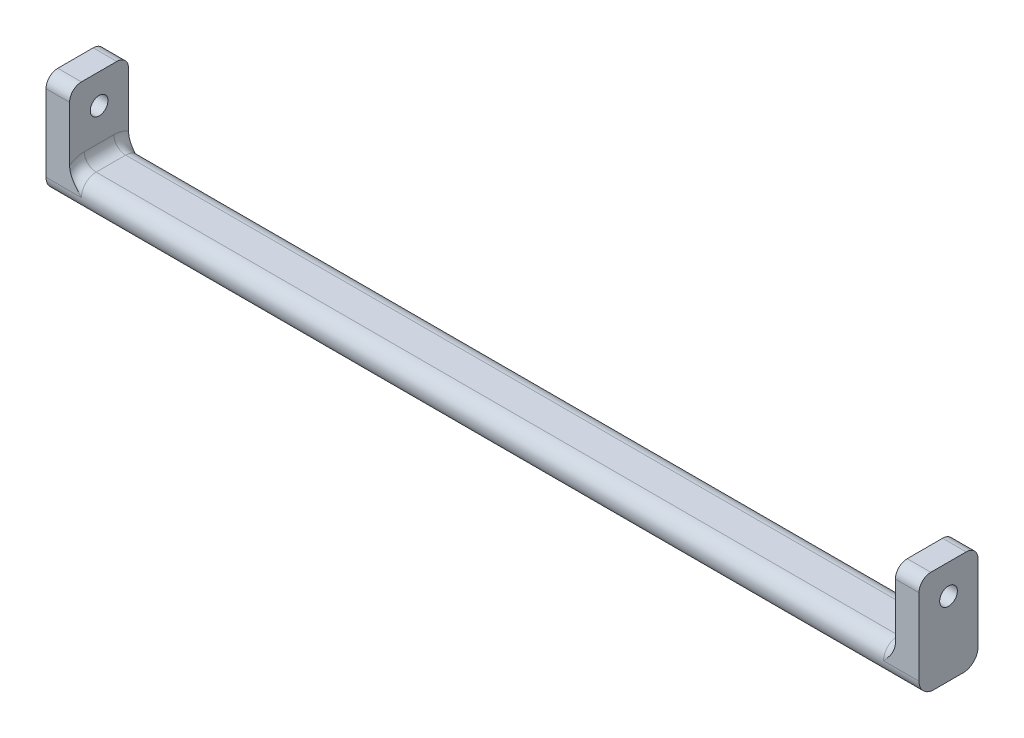
ISO-10303-21;
HEADER;
FILE_DESCRIPTION(('STEP AP214'),'2;1');
FILE_NAME('part.step','',(''),(''),'','','');
FILE_SCHEMA(('AUTOMOTIVE_DESIGN { 1 0 10303 214 1 1 1 1 }'));
ENDSEC;
DATA;
#1=APPLICATION_CONTEXT('core data for automotive mechanical design processes');
#2=APPLICATION_PROTOCOL_DEFINITION('international standard','automotive_design',2000,#1);
#3=PRODUCT_CONTEXT('',#1,'mechanical');
#4=PRODUCT('Part','Part','',(#3));
#5=PRODUCT_RELATED_PRODUCT_CATEGORY('part','',(#4));
#6=PRODUCT_DEFINITION_FORMATION('','',#4);
#7=PRODUCT_DEFINITION_CONTEXT('part definition',#1,'design');
#8=PRODUCT_DEFINITION('design','',#6,#7);
#9=PRODUCT_DEFINITION_SHAPE('','',#8);
#10=(LENGTH_UNIT() NAMED_UNIT(*) SI_UNIT(.MILLI.,.METRE.));
#11=(NAMED_UNIT(*) PLANE_ANGLE_UNIT() SI_UNIT($,.RADIAN.));
#12=(NAMED_UNIT(*) SI_UNIT($,.STERADIAN.) SOLID_ANGLE_UNIT());
#13=UNCERTAINTY_MEASURE_WITH_UNIT(LENGTH_MEASURE(1.E-05),#10,'distance_accuracy_value','');
#14=(GEOMETRIC_REPRESENTATION_CONTEXT(3) GLOBAL_UNCERTAINTY_ASSIGNED_CONTEXT((#13)) GLOBAL_UNIT_ASSIGNED_CONTEXT((#10,
#11,#12)) REPRESENTATION_CONTEXT('',''));
#15=CARTESIAN_POINT('',(0.,0.,0.));
#16=DIRECTION('',(0.,0.,1.));
#17=DIRECTION('',(1.,0.,0.));
#18=AXIS2_PLACEMENT_3D('',#15,#16,#17);
#19=CARTESIAN_POINT('',(74.,-2.5,0.));
#20=DIRECTION('',(0.,1.,0.));
#21=DIRECTION('',(0.,0.,1.));
#22=AXIS2_PLACEMENT_3D('',#19,#20,#21);
#23=PLANE('',#22);
#24=DIRECTION('',(-1.,0.,0.));
#25=VECTOR('',#24,1.);
#26=CARTESIAN_POINT('',(74.,-2.5,2.5));
#27=LINE('',#26,#25);
#28=CARTESIAN_POINT('',(74.,-2.5,2.5));
#29=VERTEX_POINT('',#28);
#30=CARTESIAN_POINT('',(-74.,-2.5,2.5));
#31=VERTEX_POINT('',#30);
#32=EDGE_CURVE('E329',#29,#31,#27,.T.);
#33=ORIENTED_EDGE('',*,*,#32,.T.);
#34=DIRECTION('',(0.,0.,-1.));
#35=VECTOR('',#34,1.);
#36=CARTESIAN_POINT('',(-74.,-2.5,0.));
#37=LINE('',#36,#35);
#38=CARTESIAN_POINT('',(-74.,-2.5,-2.5));
#39=VERTEX_POINT('',#38);
#40=EDGE_CURVE('E301',#31,#39,#37,.T.);
#41=ORIENTED_EDGE('',*,*,#40,.T.);
#42=DIRECTION('',(-1.,0.,0.));
#43=VECTOR('',#42,1.);
#44=CARTESIAN_POINT('',(74.,-2.5,-2.5));
#45=LINE('',#44,#43);
#46=CARTESIAN_POINT('',(74.,-2.5,-2.5));
#47=VERTEX_POINT('',#46);
#48=EDGE_CURVE('E348',#47,#39,#45,.T.);
#49=ORIENTED_EDGE('',*,*,#48,.F.);
#50=DIRECTION('',(0.,0.,-1.));
#51=VECTOR('',#50,1.);
#52=CARTESIAN_POINT('',(74.,-2.5,0.));
#53=LINE('',#52,#51);
#54=EDGE_CURVE('E317',#29,#47,#53,.T.);
#55=ORIENTED_EDGE('',*,*,#54,.F.);
#56=EDGE_LOOP('',(#33,#41,#49,#55));
#57=FACE_BOUND('',#56,.T.);
#58=ADVANCED_FACE('F39',(#57),#23,.F.);
#59=CARTESIAN_POINT('',(74.,0.,-2.5));
#60=DIRECTION('',(-1.,0.,0.));
#61=DIRECTION('',(0.,0.,1.));
#62=AXIS2_PLACEMENT_3D('',#59,#60,#61);
#63=CYLINDRICAL_SURFACE('',#62,2.5);
#64=DIRECTION('',(-1.,0.,0.));
#65=VECTOR('',#64,1.);
#66=CARTESIAN_POINT('',(-70.,0.,-5.));
#67=LINE('',#66,#65);
#68=CARTESIAN_POINT('',(-68.,0.,-5.));
#69=VERTEX_POINT('',#68);
#70=CARTESIAN_POINT('',(-74.,0.,-5.));
#71=VERTEX_POINT('',#70);
#72=EDGE_CURVE('E58',#69,#71,#67,.T.);
#73=ORIENTED_EDGE('',*,*,#72,.F.);
#74=CARTESIAN_POINT('',(-68.,0.,-2.5));
#75=DIRECTION('',(1.,0.,0.));
#76=DIRECTION('',(0.,0.,-1.));
#77=AXIS2_PLACEMENT_3D('',#74,#75,#76);
#78=CIRCLE('',#77,2.5);
#79=CARTESIAN_POINT('',(-68.,2.5,-2.5));
#80=VERTEX_POINT('',#79);
#81=EDGE_CURVE('E62',#69,#80,#78,.T.);
#82=ORIENTED_EDGE('',*,*,#81,.T.);
#83=DIRECTION('',(-1.,0.,0.));
#84=VECTOR('',#83,1.);
#85=CARTESIAN_POINT('',(74.,2.5,-2.5));
#86=LINE('',#85,#84);
#87=CARTESIAN_POINT('',(68.,2.5,-2.5));
#88=VERTEX_POINT('',#87);
#89=EDGE_CURVE('E345',#88,#80,#86,.T.);
#90=ORIENTED_EDGE('',*,*,#89,.F.);
#91=CARTESIAN_POINT('',(68.,0.,-2.5));
#92=DIRECTION('',(-1.,0.,0.));
#93=DIRECTION('',(0.,0.,1.));
#94=AXIS2_PLACEMENT_3D('',#91,#92,#93);
#95=CIRCLE('',#94,2.5);
#96=CARTESIAN_POINT('',(68.,0.,-5.));
#97=VERTEX_POINT('',#96);
#98=EDGE_CURVE('E367',#88,#97,#95,.T.);
#99=ORIENTED_EDGE('',*,*,#98,.T.);
#100=DIRECTION('',(1.,0.,0.));
#101=VECTOR('',#100,1.);
#102=CARTESIAN_POINT('',(70.,0.,-5.));
#103=LINE('',#102,#101);
#104=CARTESIAN_POINT('',(74.,0.,-5.));
#105=VERTEX_POINT('',#104);
#106=EDGE_CURVE('E302',#97,#105,#103,.T.);
#107=ORIENTED_EDGE('',*,*,#106,.T.);
#108=CARTESIAN_POINT('',(74.,0.,-2.5));
#109=DIRECTION('',(1.,0.,0.));
#110=DIRECTION('',(0.,0.,-1.));
#111=AXIS2_PLACEMENT_3D('',#108,#109,#110);
#112=CIRCLE('',#111,2.5);
#113=EDGE_CURVE('E321',#47,#105,#112,.T.);
#114=ORIENTED_EDGE('',*,*,#113,.F.);
#115=ORIENTED_EDGE('',*,*,#48,.T.);
#116=CARTESIAN_POINT('',(-74.,0.,-2.5));
#117=DIRECTION('',(1.,0.,0.));
#118=DIRECTION('',(0.,0.,-1.));
#119=AXIS2_PLACEMENT_3D('',#116,#117,#118);
#120=CIRCLE('',#119,2.5);
#121=EDGE_CURVE('E333',#39,#71,#120,.T.);
#122=ORIENTED_EDGE('',*,*,#121,.T.);
#123=EDGE_LOOP('',(#73,#82,#90,#99,#107,#114,#115,#122));
#124=FACE_BOUND('',#123,.T.);
#125=ADVANCED_FACE('F430',(#124),#63,.T.);
#126=CARTESIAN_POINT('',(74.,2.5,0.));
#127=DIRECTION('',(0.,1.,0.));
#128=DIRECTION('',(0.,0.,1.));
#129=AXIS2_PLACEMENT_3D('',#126,#127,#128);
#130=PLANE('',#129);
#131=ORIENTED_EDGE('',*,*,#89,.T.);
#132=DIRECTION('',(0.,0.,-1.));
#133=VECTOR('',#132,1.);
#134=CARTESIAN_POINT('',(-68.,2.5,2.5));
#135=LINE('',#134,#133);
#136=CARTESIAN_POINT('',(-68.,2.5,2.5));
#137=VERTEX_POINT('',#136);
#138=EDGE_CURVE('E451',#80,#137,#135,.F.);
#139=ORIENTED_EDGE('',*,*,#138,.T.);
#140=DIRECTION('',(-1.,0.,0.));
#141=VECTOR('',#140,1.);
#142=CARTESIAN_POINT('',(74.,2.5,2.5));
#143=LINE('',#142,#141);
#144=CARTESIAN_POINT('',(68.,2.5,2.5));
#145=VERTEX_POINT('',#144);
#146=EDGE_CURVE('E341',#145,#137,#143,.T.);
#147=ORIENTED_EDGE('',*,*,#146,.F.);
#148=DIRECTION('',(0.,0.,1.));
#149=VECTOR('',#148,1.);
#150=CARTESIAN_POINT('',(68.,2.5,-2.5));
#151=LINE('',#150,#149);
#152=EDGE_CURVE('E364',#145,#88,#151,.F.);
#153=ORIENTED_EDGE('',*,*,#152,.T.);
#154=EDGE_LOOP('',(#131,#139,#147,#153));
#155=FACE_BOUND('',#154,.T.);
#156=ADVANCED_FACE('F426',(#155),#130,.T.);
#157=CARTESIAN_POINT('',(74.,0.,2.5));
#158=DIRECTION('',(-1.,0.,0.));
#159=DIRECTION('',(0.,0.,1.));
#160=AXIS2_PLACEMENT_3D('',#157,#158,#159);
#161=CYLINDRICAL_SURFACE('',#160,2.5);
#162=ORIENTED_EDGE('',*,*,#146,.T.);
#163=CARTESIAN_POINT('',(-68.,0.,2.5));
#164=DIRECTION('',(1.,0.,0.));
#165=DIRECTION('',(0.,0.,-1.));
#166=AXIS2_PLACEMENT_3D('',#163,#164,#165);
#167=CIRCLE('',#166,2.5);
#168=CARTESIAN_POINT('',(-68.,0.,5.));
#169=VERTEX_POINT('',#168);
#170=EDGE_CURVE('E517',#137,#169,#167,.T.);
#171=ORIENTED_EDGE('',*,*,#170,.T.);
#172=DIRECTION('',(-1.,0.,0.));
#173=VECTOR('',#172,1.);
#174=CARTESIAN_POINT('',(-70.,0.,5.));
#175=LINE('',#174,#173);
#176=CARTESIAN_POINT('',(-74.,0.,5.));
#177=VERTEX_POINT('',#176);
#178=EDGE_CURVE('E248',#169,#177,#175,.T.);
#179=ORIENTED_EDGE('',*,*,#178,.T.);
#180=CARTESIAN_POINT('',(-74.,0.,2.5));
#181=DIRECTION('',(1.,0.,0.));
#182=DIRECTION('',(0.,0.,-1.));
#183=AXIS2_PLACEMENT_3D('',#180,#181,#182);
#184=CIRCLE('',#183,2.5);
#185=EDGE_CURVE('E322',#177,#31,#184,.T.);
#186=ORIENTED_EDGE('',*,*,#185,.T.);
#187=ORIENTED_EDGE('',*,*,#32,.F.);
#188=CARTESIAN_POINT('',(74.,0.,2.5));
#189=DIRECTION('',(1.,0.,0.));
#190=DIRECTION('',(0.,0.,-1.));
#191=AXIS2_PLACEMENT_3D('',#188,#189,#190);
#192=CIRCLE('',#191,2.5);
#193=CARTESIAN_POINT('',(74.,0.,5.));
#194=VERTEX_POINT('',#193);
#195=EDGE_CURVE('E326',#194,#29,#192,.T.);
#196=ORIENTED_EDGE('',*,*,#195,.F.);
#197=DIRECTION('',(1.,0.,0.));
#198=VECTOR('',#197,1.);
#199=CARTESIAN_POINT('',(70.,0.,5.));
#200=LINE('',#199,#198);
#201=CARTESIAN_POINT('',(68.,0.,5.));
#202=VERTEX_POINT('',#201);
#203=EDGE_CURVE('E305',#202,#194,#200,.T.);
#204=ORIENTED_EDGE('',*,*,#203,.F.);
#205=CARTESIAN_POINT('',(68.,0.,2.5));
#206=DIRECTION('',(-1.,0.,0.));
#207=DIRECTION('',(0.,0.,1.));
#208=AXIS2_PLACEMENT_3D('',#205,#206,#207);
#209=CIRCLE('',#208,2.5);
#210=EDGE_CURVE('E351',#202,#145,#209,.T.);
#211=ORIENTED_EDGE('',*,*,#210,.T.);
#212=EDGE_LOOP('',(#162,#171,#179,#186,#187,#196,#204,#211));
#213=FACE_BOUND('',#212,.T.);
#214=ADVANCED_FACE('F419',(#213),#161,.T.);
#215=CARTESIAN_POINT('',(74.,0.,0.));
#216=DIRECTION('',(1.,0.,0.));
#217=DIRECTION('',(0.,0.,-1.));
#218=AXIS2_PLACEMENT_3D('',#215,#216,#217);
#219=PLANE('',#218);
#220=CARTESIAN_POINT('',(74.,10.,0.));
#221=DIRECTION('',(1.,0.,0.));
#222=DIRECTION('',(0.,0.,-1.));
#223=AXIS2_PLACEMENT_3D('',#220,#221,#222);
#224=CIRCLE('',#223,1.5);
#225=CARTESIAN_POINT('',(74.,10.,-1.5));
#226=VERTEX_POINT('',#225);
#227=EDGE_CURVE('E239',#226,#226,#224,.T.);
#228=ORIENTED_EDGE('',*,*,#227,.F.);
#229=EDGE_LOOP('',(#228));
#230=FACE_BOUND('',#229,.T.);
#231=ORIENTED_EDGE('',*,*,#113,.T.);
#232=DIRECTION('',(0.,1.,0.));
#233=VECTOR('',#232,1.);
#234=CARTESIAN_POINT('',(74.,0.,-5.));
#235=LINE('',#234,#233);
#236=CARTESIAN_POINT('',(74.,13.,-5.));
#237=VERTEX_POINT('',#236);
#238=EDGE_CURVE('E263',#105,#237,#235,.T.);
#239=ORIENTED_EDGE('',*,*,#238,.T.);
#240=CARTESIAN_POINT('',(74.,13.,-3.));
#241=DIRECTION('',(1.,0.,0.));
#242=DIRECTION('',(0.,0.,1.));
#243=AXIS2_PLACEMENT_3D('',#240,#241,#242);
#244=CIRCLE('',#243,2.);
#245=CARTESIAN_POINT('',(74.,15.,-3.));
#246=VERTEX_POINT('',#245);
#247=EDGE_CURVE('E279',#237,#246,#244,.T.);
#248=ORIENTED_EDGE('',*,*,#247,.T.);
#249=DIRECTION('',(0.,0.,1.));
#250=VECTOR('',#249,1.);
#251=CARTESIAN_POINT('',(74.,15.,3.));
#252=LINE('',#251,#250);
#253=CARTESIAN_POINT('',(74.,15.,3.));
#254=VERTEX_POINT('',#253);
#255=EDGE_CURVE('E283',#246,#254,#252,.T.);
#256=ORIENTED_EDGE('',*,*,#255,.T.);
#257=CARTESIAN_POINT('',(74.,13.,3.));
#258=DIRECTION('',(1.,0.,0.));
#259=DIRECTION('',(0.,0.,1.));
#260=AXIS2_PLACEMENT_3D('',#257,#258,#259);
#261=CIRCLE('',#260,2.);
#262=CARTESIAN_POINT('',(74.,13.,5.));
#263=VERTEX_POINT('',#262);
#264=EDGE_CURVE('E288',#254,#263,#261,.T.);
#265=ORIENTED_EDGE('',*,*,#264,.T.);
#266=DIRECTION('',(0.,-1.,0.));
#267=VECTOR('',#266,1.);
#268=CARTESIAN_POINT('',(74.,0.,5.));
#269=LINE('',#268,#267);
#270=EDGE_CURVE('E292',#263,#194,#269,.T.);
#271=ORIENTED_EDGE('',*,*,#270,.T.);
#272=ORIENTED_EDGE('',*,*,#195,.T.);
#273=ORIENTED_EDGE('',*,*,#54,.T.);
#274=EDGE_LOOP('',(#231,#239,#248,#256,#265,#271,#272,#273));
#275=FACE_BOUND('',#274,.T.);
#276=ADVANCED_FACE('F415',(#230,#275),#219,.T.);
#277=CARTESIAN_POINT('',(-74.,0.,0.));
#278=DIRECTION('',(1.,0.,0.));
#279=DIRECTION('',(0.,0.,-1.));
#280=AXIS2_PLACEMENT_3D('',#277,#278,#279);
#281=PLANE('',#280);
#282=CARTESIAN_POINT('',(-74.,10.,0.));
#283=DIRECTION('',(1.,0.,0.));
#284=DIRECTION('',(0.,0.,-1.));
#285=AXIS2_PLACEMENT_3D('',#282,#283,#284);
#286=CIRCLE('',#285,1.5);
#287=CARTESIAN_POINT('',(-74.,10.,-1.5));
#288=VERTEX_POINT('',#287);
#289=EDGE_CURVE('E216',#288,#288,#286,.T.);
#290=ORIENTED_EDGE('',*,*,#289,.T.);
#291=EDGE_LOOP('',(#290));
#292=FACE_BOUND('',#291,.T.);
#293=DIRECTION('',(0.,1.,0.));
#294=VECTOR('',#293,1.);
#295=CARTESIAN_POINT('',(-74.,0.,-5.));
#296=LINE('',#295,#294);
#297=CARTESIAN_POINT('',(-74.,13.,-5.));
#298=VERTEX_POINT('',#297);
#299=EDGE_CURVE('E197',#71,#298,#296,.T.);
#300=ORIENTED_EDGE('',*,*,#299,.F.);
#301=ORIENTED_EDGE('',*,*,#121,.F.);
#302=ORIENTED_EDGE('',*,*,#40,.F.);
#303=ORIENTED_EDGE('',*,*,#185,.F.);
#304=DIRECTION('',(0.,-1.,0.));
#305=VECTOR('',#304,1.);
#306=CARTESIAN_POINT('',(-74.,0.,5.));
#307=LINE('',#306,#305);
#308=CARTESIAN_POINT('',(-74.,13.,5.));
#309=VERTEX_POINT('',#308);
#310=EDGE_CURVE('E231',#309,#177,#307,.T.);
#311=ORIENTED_EDGE('',*,*,#310,.F.);
#312=CARTESIAN_POINT('',(-74.,13.,3.));
#313=DIRECTION('',(1.,0.,0.));
#314=DIRECTION('',(0.,0.,1.));
#315=AXIS2_PLACEMENT_3D('',#312,#313,#314);
#316=CIRCLE('',#315,2.);
#317=CARTESIAN_POINT('',(-74.,15.,3.));
#318=VERTEX_POINT('',#317);
#319=EDGE_CURVE('E213',#318,#309,#316,.T.);
#320=ORIENTED_EDGE('',*,*,#319,.F.);
#321=DIRECTION('',(0.,0.,1.));
#322=VECTOR('',#321,1.);
#323=CARTESIAN_POINT('',(-74.,15.,3.));
#324=LINE('',#323,#322);
#325=CARTESIAN_POINT('',(-74.,15.,-3.));
#326=VERTEX_POINT('',#325);
#327=EDGE_CURVE('E208',#326,#318,#324,.T.);
#328=ORIENTED_EDGE('',*,*,#327,.F.);
#329=CARTESIAN_POINT('',(-74.,13.,-3.));
#330=DIRECTION('',(1.,0.,0.));
#331=DIRECTION('',(0.,0.,1.));
#332=AXIS2_PLACEMENT_3D('',#329,#330,#331);
#333=CIRCLE('',#332,2.);
#334=EDGE_CURVE('E225',#298,#326,#333,.T.);
#335=ORIENTED_EDGE('',*,*,#334,.F.);
#336=EDGE_LOOP('',(#300,#301,#302,#303,#311,#320,#328,#335));
#337=FACE_BOUND('',#336,.T.);
#338=ADVANCED_FACE('F418',(#292,#337),#281,.F.);
#339=CARTESIAN_POINT('',(70.,13.,-3.));
#340=DIRECTION('',(-1.,0.,0.));
#341=DIRECTION('',(0.,0.,1.));
#342=AXIS2_PLACEMENT_3D('',#339,#340,#341);
#343=PLANE('',#342);
#344=CARTESIAN_POINT('',(70.,10.,0.));
#345=DIRECTION('',(-1.,0.,0.));
#346=DIRECTION('',(0.,0.,1.));
#347=AXIS2_PLACEMENT_3D('',#344,#345,#346);
#348=CIRCLE('',#347,1.5);
#349=CARTESIAN_POINT('',(70.,10.,1.5));
#350=VERTEX_POINT('',#349);
#351=EDGE_CURVE('E257',#350,#350,#348,.T.);
#352=ORIENTED_EDGE('',*,*,#351,.F.);
#353=EDGE_LOOP('',(#352));
#354=FACE_BOUND('',#353,.T.);
#355=DIRECTION('',(0.,0.,1.));
#356=VECTOR('',#355,1.);
#357=CARTESIAN_POINT('',(70.,4.5,2.5));
#358=LINE('',#357,#356);
#359=CARTESIAN_POINT('',(70.,4.5,-2.5));
#360=VERTEX_POINT('',#359);
#361=CARTESIAN_POINT('',(70.,4.5,2.5));
#362=VERTEX_POINT('',#361);
#363=EDGE_CURVE('E358',#360,#362,#358,.T.);
#364=ORIENTED_EDGE('',*,*,#363,.T.);
#365=CARTESIAN_POINT('',(70.,0.,2.5));
#366=DIRECTION('',(-1.,0.,0.));
#367=DIRECTION('',(0.,0.,1.));
#368=AXIS2_PLACEMENT_3D('',#365,#366,#367);
#369=CIRCLE('',#368,4.5);
#370=CARTESIAN_POINT('',(70.,3.74165738677394,5.));
#371=VERTEX_POINT('',#370);
#372=EDGE_CURVE('E361',#362,#371,#369,.F.);
#373=ORIENTED_EDGE('',*,*,#372,.T.);
#374=DIRECTION('',(0.,-1.,0.));
#375=VECTOR('',#374,1.);
#376=CARTESIAN_POINT('',(70.,0.,5.));
#377=LINE('',#376,#375);
#378=CARTESIAN_POINT('',(70.,13.,5.));
#379=VERTEX_POINT('',#378);
#380=EDGE_CURVE('E271',#379,#371,#377,.T.);
#381=ORIENTED_EDGE('',*,*,#380,.F.);
#382=CARTESIAN_POINT('',(70.,13.,3.));
#383=DIRECTION('',(1.,0.,0.));
#384=DIRECTION('',(0.,0.,1.));
#385=AXIS2_PLACEMENT_3D('',#382,#383,#384);
#386=CIRCLE('',#385,2.);
#387=CARTESIAN_POINT('',(70.,15.,3.));
#388=VERTEX_POINT('',#387);
#389=EDGE_CURVE('E267',#388,#379,#386,.T.);
#390=ORIENTED_EDGE('',*,*,#389,.F.);
#391=DIRECTION('',(0.,0.,1.));
#392=VECTOR('',#391,1.);
#393=CARTESIAN_POINT('',(70.,15.,3.));
#394=LINE('',#393,#392);
#395=CARTESIAN_POINT('',(70.,15.,-3.));
#396=VERTEX_POINT('',#395);
#397=EDGE_CURVE('E262',#396,#388,#394,.T.);
#398=ORIENTED_EDGE('',*,*,#397,.F.);
#399=CARTESIAN_POINT('',(70.,13.,-3.));
#400=DIRECTION('',(1.,0.,0.));
#401=DIRECTION('',(0.,0.,1.));
#402=AXIS2_PLACEMENT_3D('',#399,#400,#401);
#403=CIRCLE('',#402,2.);
#404=CARTESIAN_POINT('',(70.,13.,-5.));
#405=VERTEX_POINT('',#404);
#406=EDGE_CURVE('E258',#405,#396,#403,.T.);
#407=ORIENTED_EDGE('',*,*,#406,.F.);
#408=DIRECTION('',(0.,1.,0.));
#409=VECTOR('',#408,1.);
#410=CARTESIAN_POINT('',(70.,0.,-5.));
#411=LINE('',#410,#409);
#412=CARTESIAN_POINT('',(70.,3.74165738677394,-5.));
#413=VERTEX_POINT('',#412);
#414=EDGE_CURVE('E275',#413,#405,#411,.T.);
#415=ORIENTED_EDGE('',*,*,#414,.F.);
#416=CARTESIAN_POINT('',(70.,0.,-2.5));
#417=DIRECTION('',(-1.,0.,0.));
#418=DIRECTION('',(0.,0.,1.));
#419=AXIS2_PLACEMENT_3D('',#416,#417,#418);
#420=CIRCLE('',#419,4.5);
#421=EDGE_CURVE('E355',#413,#360,#420,.F.);
#422=ORIENTED_EDGE('',*,*,#421,.T.);
#423=EDGE_LOOP('',(#364,#373,#381,#390,#398,#407,#415,#422));
#424=FACE_BOUND('',#423,.T.);
#425=ADVANCED_FACE('F413',(#354,#424),#343,.T.);
#426=CARTESIAN_POINT('',(70.,13.,-3.));
#427=DIRECTION('',(1.,0.,0.));
#428=DIRECTION('',(0.,0.,-1.));
#429=AXIS2_PLACEMENT_3D('',#426,#427,#428);
#430=CYLINDRICAL_SURFACE('',#429,2.);
#431=ORIENTED_EDGE('',*,*,#247,.F.);
#432=DIRECTION('',(1.,0.,0.));
#433=VECTOR('',#432,1.);
#434=CARTESIAN_POINT('',(70.,13.,-5.));
#435=LINE('',#434,#433);
#436=EDGE_CURVE('E298',#405,#237,#435,.T.);
#437=ORIENTED_EDGE('',*,*,#436,.F.);
#438=ORIENTED_EDGE('',*,*,#406,.T.);
#439=DIRECTION('',(1.,0.,0.));
#440=VECTOR('',#439,1.);
#441=CARTESIAN_POINT('',(70.,15.,-3.));
#442=LINE('',#441,#440);
#443=EDGE_CURVE('E278',#396,#246,#442,.T.);
#444=ORIENTED_EDGE('',*,*,#443,.T.);
#445=EDGE_LOOP('',(#431,#437,#438,#444));
#446=FACE_BOUND('',#445,.T.);
#447=ADVANCED_FACE('F410',(#446),#430,.T.);
#448=CARTESIAN_POINT('',(70.,0.,-5.));
#449=DIRECTION('',(0.,0.,-1.));
#450=DIRECTION('',(0.,1.,0.));
#451=AXIS2_PLACEMENT_3D('',#448,#449,#450);
#452=PLANE('',#451);
#453=ORIENTED_EDGE('',*,*,#238,.F.);
#454=ORIENTED_EDGE('',*,*,#106,.F.);
#455=CARTESIAN_POINT('',(70.,3.74165738677394,-5.));
#456=CARTESIAN_POINT('',(70.0000029476738,3.65632022214261,-5.));
#457=CARTESIAN_POINT('',(69.9962246039228,3.57104650722592,-5.));
#458=CARTESIAN_POINT('',(69.9816396076361,3.40121212242883,-5.));
#459=CARTESIAN_POINT('',(69.9708424955467,3.31665064224219,-5.));
#460=CARTESIAN_POINT('',(69.9290197315009,3.0664418046721,-5.));
#461=CARTESIAN_POINT('',(69.8885375235695,2.90234479985508,-5.));
#462=CARTESIAN_POINT('',(69.7582869921917,2.4921653644754,-5.));
#463=CARTESIAN_POINT('',(69.6536448347525,2.25089296686965,-5.));
#464=CARTESIAN_POINT('',(69.4085319234268,1.78636723775075,-5.));
#465=CARTESIAN_POINT('',(69.2678440388574,1.56323430037496,-5.));
#466=CARTESIAN_POINT('',(68.9485475232768,1.11087747568147,-5.));
#467=CARTESIAN_POINT('',(68.7675209529466,0.883414460727938,-5.));
#468=CARTESIAN_POINT('',(68.3932264614403,0.439773014039501,-5.));
#469=CARTESIAN_POINT('',(68.19997487924,0.223580196451603,-5.));
#470=CARTESIAN_POINT('',(68.0044444428848,0.00496903928847675,-5.));
#471=CARTESIAN_POINT('',(68.002222220498,0.00248451938497437,-5.));
#472=CARTESIAN_POINT('',(68.,0.,-5.));
#473=B_SPLINE_CURVE_WITH_KNOTS('',3,(#455,#456,#457,#458,#459,#460,#461,#462,#463,#464,#465,
#466,#467,#468,#469,#470,#471,#472),.UNSPECIFIED.,.F.,.F.,(4,2,2,2,2,2,2,2,4),(0.,
0.255825447875168,0.511303883326145,1.01655122970014,1.80102575568041,2.59034166730717,
3.46137204585407,4.33126191258271,4.34126191263601),.UNSPECIFIED.);
#474=EDGE_CURVE('E381',#97,#413,#473,.F.);
#475=ORIENTED_EDGE('',*,*,#474,.T.);
#476=ORIENTED_EDGE('',*,*,#414,.T.);
#477=ORIENTED_EDGE('',*,*,#436,.T.);
#478=EDGE_LOOP('',(#453,#454,#475,#476,#477));
#479=FACE_BOUND('',#478,.T.);
#480=ADVANCED_FACE('F398',(#479),#452,.T.);
#481=CARTESIAN_POINT('',(70.,0.,5.));
#482=DIRECTION('',(0.,0.,1.));
#483=DIRECTION('',(0.,-1.,0.));
#484=AXIS2_PLACEMENT_3D('',#481,#482,#483);
#485=PLANE('',#484);
#486=ORIENTED_EDGE('',*,*,#270,.F.);
#487=DIRECTION('',(1.,0.,0.));
#488=VECTOR('',#487,1.);
#489=CARTESIAN_POINT('',(70.,13.,5.));
#490=LINE('',#489,#488);
#491=EDGE_CURVE('E309',#379,#263,#490,.T.);
#492=ORIENTED_EDGE('',*,*,#491,.F.);
#493=ORIENTED_EDGE('',*,*,#380,.T.);
#494=CARTESIAN_POINT('',(70.,3.74165738677394,5.));
#495=CARTESIAN_POINT('',(70.0000029476738,3.65632022214261,5.));
#496=CARTESIAN_POINT('',(69.9962246039228,3.57104650722592,5.));
#497=CARTESIAN_POINT('',(69.9816396076361,3.40121212242883,5.));
#498=CARTESIAN_POINT('',(69.9708424955467,3.31665064224219,5.));
#499=CARTESIAN_POINT('',(69.9290197315009,3.06644180467209,5.));
#500=CARTESIAN_POINT('',(69.8885375235695,2.90234479985508,5.));
#501=CARTESIAN_POINT('',(69.7582869921917,2.4921653644754,5.));
#502=CARTESIAN_POINT('',(69.6536448347525,2.25089296686964,5.));
#503=CARTESIAN_POINT('',(69.4085319234268,1.78636723775075,5.));
#504=CARTESIAN_POINT('',(69.2678440388574,1.56323430037496,5.));
#505=CARTESIAN_POINT('',(68.9485475232768,1.11087747568147,5.));
#506=CARTESIAN_POINT('',(68.7675209529466,0.883414460727937,5.));
#507=CARTESIAN_POINT('',(68.3932264614403,0.4397730140395,5.));
#508=CARTESIAN_POINT('',(68.19997487924,0.223580196451603,5.));
#509=CARTESIAN_POINT('',(68.0044444428848,0.00496903928847585,5.));
#510=CARTESIAN_POINT('',(68.002222220498,0.00248451938497346,5.));
#511=CARTESIAN_POINT('',(68.,0.,5.));
#512=B_SPLINE_CURVE_WITH_KNOTS('',3,(#494,#495,#496,#497,#498,#499,#500,#501,#502,#503,#504,
#505,#506,#507,#508,#509,#510,#511),.UNSPECIFIED.,.F.,.F.,(4,2,2,2,2,2,2,2,4),(0.,
0.255825447875168,0.511303883326145,1.01655122970014,1.80102575568041,2.59034166730717,
3.46137204585407,4.33126191258271,4.34126191263601),.UNSPECIFIED.);
#513=EDGE_CURVE('E371',#371,#202,#512,.T.);
#514=ORIENTED_EDGE('',*,*,#513,.T.);
#515=ORIENTED_EDGE('',*,*,#203,.T.);
#516=EDGE_LOOP('',(#486,#492,#493,#514,#515));
#517=FACE_BOUND('',#516,.T.);
#518=ADVANCED_FACE('F393',(#517),#485,.T.);
#519=CARTESIAN_POINT('',(70.,13.,3.));
#520=DIRECTION('',(1.,0.,0.));
#521=DIRECTION('',(0.,0.,-1.));
#522=AXIS2_PLACEMENT_3D('',#519,#520,#521);
#523=CYLINDRICAL_SURFACE('',#522,2.);
#524=ORIENTED_EDGE('',*,*,#264,.F.);
#525=DIRECTION('',(1.,0.,0.));
#526=VECTOR('',#525,1.);
#527=CARTESIAN_POINT('',(70.,15.,3.));
#528=LINE('',#527,#526);
#529=EDGE_CURVE('E312',#388,#254,#528,.T.);
#530=ORIENTED_EDGE('',*,*,#529,.F.);
#531=ORIENTED_EDGE('',*,*,#389,.T.);
#532=ORIENTED_EDGE('',*,*,#491,.T.);
#533=EDGE_LOOP('',(#524,#530,#531,#532));
#534=FACE_BOUND('',#533,.T.);
#535=ADVANCED_FACE('F397',(#534),#523,.T.);
#536=CARTESIAN_POINT('',(70.,15.,3.));
#537=DIRECTION('',(0.,1.,0.));
#538=DIRECTION('',(0.,0.,1.));
#539=AXIS2_PLACEMENT_3D('',#536,#537,#538);
#540=PLANE('',#539);
#541=ORIENTED_EDGE('',*,*,#255,.F.);
#542=ORIENTED_EDGE('',*,*,#443,.F.);
#543=ORIENTED_EDGE('',*,*,#397,.T.);
#544=ORIENTED_EDGE('',*,*,#529,.T.);
#545=EDGE_LOOP('',(#541,#542,#543,#544));
#546=FACE_BOUND('',#545,.T.);
#547=ADVANCED_FACE('F404',(#546),#540,.T.);
#548=CARTESIAN_POINT('',(68.,0.,-2.5));
#549=DIRECTION('',(-1.,0.,0.));
#550=DIRECTION('',(0.,0.,1.));
#551=AXIS2_PLACEMENT_3D('',#548,#549,#550);
#552=TOROIDAL_SURFACE('',#551,4.5,2.);
#553=ORIENTED_EDGE('',*,*,#474,.F.);
#554=ORIENTED_EDGE('',*,*,#98,.F.);
#555=CARTESIAN_POINT('',(68.,4.5,-2.5));
#556=DIRECTION('',(0.,0.,-1.));
#557=DIRECTION('',(0.,1.,0.));
#558=AXIS2_PLACEMENT_3D('',#555,#556,#557);
#559=CIRCLE('',#558,2.);
#560=EDGE_CURVE('E284',#360,#88,#559,.T.);
#561=ORIENTED_EDGE('',*,*,#560,.F.);
#562=ORIENTED_EDGE('',*,*,#421,.F.);
#563=EDGE_LOOP('',(#553,#554,#561,#562));
#564=FACE_BOUND('',#563,.T.);
#565=ADVANCED_FACE('F408',(#564),#552,.F.);
#566=CARTESIAN_POINT('',(68.,4.5,-3.));
#567=DIRECTION('',(0.,0.,-1.));
#568=DIRECTION('',(0.,1.,0.));
#569=AXIS2_PLACEMENT_3D('',#566,#567,#568);
#570=CYLINDRICAL_SURFACE('',#569,2.);
#571=ORIENTED_EDGE('',*,*,#560,.T.);
#572=ORIENTED_EDGE('',*,*,#152,.F.);
#573=CARTESIAN_POINT('',(68.,4.5,2.5));
#574=DIRECTION('',(0.,0.,-1.));
#575=DIRECTION('',(-1.,0.,0.));
#576=AXIS2_PLACEMENT_3D('',#573,#574,#575);
#577=CIRCLE('',#576,2.);
#578=EDGE_CURVE('E508',#362,#145,#577,.T.);
#579=ORIENTED_EDGE('',*,*,#578,.F.);
#580=ORIENTED_EDGE('',*,*,#363,.F.);
#581=EDGE_LOOP('',(#571,#572,#579,#580));
#582=FACE_BOUND('',#581,.T.);
#583=ADVANCED_FACE('F510',(#582),#570,.F.);
#584=CARTESIAN_POINT('',(68.,0.,2.5));
#585=DIRECTION('',(-1.,0.,0.));
#586=DIRECTION('',(0.,0.,1.));
#587=AXIS2_PLACEMENT_3D('',#584,#585,#586);
#588=TOROIDAL_SURFACE('',#587,4.5,2.);
#589=ORIENTED_EDGE('',*,*,#513,.F.);
#590=ORIENTED_EDGE('',*,*,#372,.F.);
#591=ORIENTED_EDGE('',*,*,#578,.T.);
#592=ORIENTED_EDGE('',*,*,#210,.F.);
#593=EDGE_LOOP('',(#589,#590,#591,#592));
#594=FACE_BOUND('',#593,.T.);
#595=ADVANCED_FACE('F389',(#594),#588,.F.);
#596=CARTESIAN_POINT('',(69.,10.,0.));
#597=DIRECTION('',(1.,0.,0.));
#598=DIRECTION('',(0.,0.,-1.));
#599=AXIS2_PLACEMENT_3D('',#596,#597,#598);
#600=CYLINDRICAL_SURFACE('',#599,1.5);
#601=ORIENTED_EDGE('',*,*,#351,.T.);
#602=EDGE_LOOP('',(#601));
#603=FACE_BOUND('',#602,.T.);
#604=ORIENTED_EDGE('',*,*,#227,.T.);
#605=EDGE_LOOP('',(#604));
#606=FACE_BOUND('',#605,.T.);
#607=ADVANCED_FACE('F486',(#603,#606),#600,.F.);
#608=CARTESIAN_POINT('',(-70.,13.,-3.));
#609=DIRECTION('',(-1.,0.,0.));
#610=DIRECTION('',(0.,0.,1.));
#611=AXIS2_PLACEMENT_3D('',#608,#609,#610);
#612=CYLINDRICAL_SURFACE('',#611,2.);
#613=ORIENTED_EDGE('',*,*,#334,.T.);
#614=DIRECTION('',(-1.,0.,0.));
#615=VECTOR('',#614,1.);
#616=CARTESIAN_POINT('',(-70.,15.,-3.));
#617=LINE('',#616,#615);
#618=CARTESIAN_POINT('',(-70.,15.,-3.));
#619=VERTEX_POINT('',#618);
#620=EDGE_CURVE('E206',#619,#326,#617,.T.);
#621=ORIENTED_EDGE('',*,*,#620,.F.);
#622=CARTESIAN_POINT('',(-70.,13.,-3.));
#623=DIRECTION('',(1.,0.,0.));
#624=DIRECTION('',(0.,0.,1.));
#625=AXIS2_PLACEMENT_3D('',#622,#623,#624);
#626=CIRCLE('',#625,2.);
#627=CARTESIAN_POINT('',(-70.,13.,-5.));
#628=VERTEX_POINT('',#627);
#629=EDGE_CURVE('E184',#628,#619,#626,.T.);
#630=ORIENTED_EDGE('',*,*,#629,.F.);
#631=DIRECTION('',(-1.,0.,0.));
#632=VECTOR('',#631,1.);
#633=CARTESIAN_POINT('',(-70.,13.,-5.));
#634=LINE('',#633,#632);
#635=EDGE_CURVE('E194',#628,#298,#634,.T.);
#636=ORIENTED_EDGE('',*,*,#635,.T.);
#637=EDGE_LOOP('',(#613,#621,#630,#636));
#638=FACE_BOUND('',#637,.T.);
#639=ADVANCED_FACE('F204',(#638),#612,.T.);
#640=CARTESIAN_POINT('',(-70.,15.,3.));
#641=DIRECTION('',(0.,-1.,0.));
#642=DIRECTION('',(0.,0.,-1.));
#643=AXIS2_PLACEMENT_3D('',#640,#641,#642);
#644=PLANE('',#643);
#645=ORIENTED_EDGE('',*,*,#327,.T.);
#646=DIRECTION('',(-1.,0.,0.));
#647=VECTOR('',#646,1.);
#648=CARTESIAN_POINT('',(-70.,15.,3.));
#649=LINE('',#648,#647);
#650=CARTESIAN_POINT('',(-70.,15.,3.));
#651=VERTEX_POINT('',#650);
#652=EDGE_CURVE('E240',#651,#318,#649,.T.);
#653=ORIENTED_EDGE('',*,*,#652,.F.);
#654=DIRECTION('',(0.,0.,1.));
#655=VECTOR('',#654,1.);
#656=CARTESIAN_POINT('',(-70.,15.,3.));
#657=LINE('',#656,#655);
#658=EDGE_CURVE('E202',#619,#651,#657,.T.);
#659=ORIENTED_EDGE('',*,*,#658,.F.);
#660=ORIENTED_EDGE('',*,*,#620,.T.);
#661=EDGE_LOOP('',(#645,#653,#659,#660));
#662=FACE_BOUND('',#661,.T.);
#663=ADVANCED_FACE('F485',(#662),#644,.F.);
#664=CARTESIAN_POINT('',(-70.,13.,3.));
#665=DIRECTION('',(-1.,0.,0.));
#666=DIRECTION('',(0.,0.,1.));
#667=AXIS2_PLACEMENT_3D('',#664,#665,#666);
#668=CYLINDRICAL_SURFACE('',#667,2.);
#669=ORIENTED_EDGE('',*,*,#319,.T.);
#670=DIRECTION('',(-1.,0.,0.));
#671=VECTOR('',#670,1.);
#672=CARTESIAN_POINT('',(-70.,13.,5.));
#673=LINE('',#672,#671);
#674=CARTESIAN_POINT('',(-70.,13.,5.));
#675=VERTEX_POINT('',#674);
#676=EDGE_CURVE('E244',#675,#309,#673,.T.);
#677=ORIENTED_EDGE('',*,*,#676,.F.);
#678=CARTESIAN_POINT('',(-70.,13.,3.));
#679=DIRECTION('',(1.,0.,0.));
#680=DIRECTION('',(0.,0.,1.));
#681=AXIS2_PLACEMENT_3D('',#678,#679,#680);
#682=CIRCLE('',#681,2.);
#683=EDGE_CURVE('E220',#651,#675,#682,.T.);
#684=ORIENTED_EDGE('',*,*,#683,.F.);
#685=ORIENTED_EDGE('',*,*,#652,.T.);
#686=EDGE_LOOP('',(#669,#677,#684,#685));
#687=FACE_BOUND('',#686,.T.);
#688=ADVANCED_FACE('F477',(#687),#668,.T.);
#689=CARTESIAN_POINT('',(-70.,0.,5.));
#690=DIRECTION('',(0.,0.,-1.));
#691=DIRECTION('',(0.,1.,0.));
#692=AXIS2_PLACEMENT_3D('',#689,#690,#691);
#693=PLANE('',#692);
#694=ORIENTED_EDGE('',*,*,#310,.T.);
#695=ORIENTED_EDGE('',*,*,#178,.F.);
#696=CARTESIAN_POINT('',(-70.,3.74165738677394,5.));
#697=CARTESIAN_POINT('',(-70.0000029476738,3.65632022214261,5.));
#698=CARTESIAN_POINT('',(-69.9962246039228,3.57104650722592,5.));
#699=CARTESIAN_POINT('',(-69.9816396076361,3.40121212242883,5.));
#700=CARTESIAN_POINT('',(-69.9708424955467,3.31665064224219,5.));
#701=CARTESIAN_POINT('',(-69.9290197315009,3.06644180467209,5.));
#702=CARTESIAN_POINT('',(-69.8885375235695,2.90234479985508,5.));
#703=CARTESIAN_POINT('',(-69.7582869921917,2.4921653644754,5.));
#704=CARTESIAN_POINT('',(-69.6536448347525,2.25089296686964,5.));
#705=CARTESIAN_POINT('',(-69.4085319234268,1.78636723775075,5.));
#706=CARTESIAN_POINT('',(-69.2678440388574,1.56323430037496,5.));
#707=CARTESIAN_POINT('',(-68.9485475232768,1.11087747568147,5.));
#708=CARTESIAN_POINT('',(-68.7675209529466,0.883414460727937,5.));
#709=CARTESIAN_POINT('',(-68.3932264614403,0.4397730140395,5.));
#710=CARTESIAN_POINT('',(-68.19997487924,0.223580196451603,5.));
#711=CARTESIAN_POINT('',(-68.0044444428848,0.00496903928847585,5.));
#712=CARTESIAN_POINT('',(-68.002222220498,0.00248451938497346,5.));
#713=CARTESIAN_POINT('',(-68.,0.,5.));
#714=B_SPLINE_CURVE_WITH_KNOTS('',3,(#696,#697,#698,#699,#700,#701,#702,#703,#704,#705,#706,
#707,#708,#709,#710,#711,#712,#713),.UNSPECIFIED.,.F.,.F.,(4,2,2,2,2,2,2,2,4),(0.,
0.255825447875168,0.511303883326145,1.01655122970014,1.80102575568041,2.59034166730717,
3.46137204585407,4.33126191258271,4.34126191263601),.UNSPECIFIED.);
#715=CARTESIAN_POINT('',(-70.,3.74165738677394,5.));
#716=VERTEX_POINT('',#715);
#717=EDGE_CURVE('E50',#169,#716,#714,.F.);
#718=ORIENTED_EDGE('',*,*,#717,.T.);
#719=DIRECTION('',(0.,-1.,0.));
#720=VECTOR('',#719,1.);
#721=CARTESIAN_POINT('',(-70.,0.,5.));
#722=LINE('',#721,#720);
#723=EDGE_CURVE('E191',#675,#716,#722,.T.);
#724=ORIENTED_EDGE('',*,*,#723,.F.);
#725=ORIENTED_EDGE('',*,*,#676,.T.);
#726=EDGE_LOOP('',(#694,#695,#718,#724,#725));
#727=FACE_BOUND('',#726,.T.);
#728=ADVANCED_FACE('F473',(#727),#693,.F.);
#729=CARTESIAN_POINT('',(-70.,0.,-5.));
#730=DIRECTION('',(0.,0.,1.));
#731=DIRECTION('',(0.,-1.,0.));
#732=AXIS2_PLACEMENT_3D('',#729,#730,#731);
#733=PLANE('',#732);
#734=ORIENTED_EDGE('',*,*,#299,.T.);
#735=ORIENTED_EDGE('',*,*,#635,.F.);
#736=DIRECTION('',(0.,1.,0.));
#737=VECTOR('',#736,1.);
#738=CARTESIAN_POINT('',(-70.,0.,-5.));
#739=LINE('',#738,#737);
#740=CARTESIAN_POINT('',(-70.,3.74165738677394,-5.));
#741=VERTEX_POINT('',#740);
#742=EDGE_CURVE('E179',#741,#628,#739,.T.);
#743=ORIENTED_EDGE('',*,*,#742,.F.);
#744=CARTESIAN_POINT('',(-70.,3.74165738677394,-5.));
#745=CARTESIAN_POINT('',(-70.0000029476738,3.65632022214261,-5.));
#746=CARTESIAN_POINT('',(-69.9962246039228,3.57104650722592,-5.));
#747=CARTESIAN_POINT('',(-69.9816396076361,3.40121212242883,-5.));
#748=CARTESIAN_POINT('',(-69.9708424955467,3.31665064224219,-5.));
#749=CARTESIAN_POINT('',(-69.9290197315009,3.0664418046721,-5.));
#750=CARTESIAN_POINT('',(-69.8885375235695,2.90234479985508,-5.));
#751=CARTESIAN_POINT('',(-69.7582869921917,2.4921653644754,-5.));
#752=CARTESIAN_POINT('',(-69.6536448347525,2.25089296686965,-5.));
#753=CARTESIAN_POINT('',(-69.4085319234268,1.78636723775075,-5.));
#754=CARTESIAN_POINT('',(-69.2678440388574,1.56323430037496,-5.));
#755=CARTESIAN_POINT('',(-68.9485475232768,1.11087747568147,-5.));
#756=CARTESIAN_POINT('',(-68.7675209529466,0.883414460727938,-5.));
#757=CARTESIAN_POINT('',(-68.3932264614403,0.439773014039501,-5.));
#758=CARTESIAN_POINT('',(-68.19997487924,0.223580196451603,-5.));
#759=CARTESIAN_POINT('',(-68.0044444428848,0.00496903928847675,-5.));
#760=CARTESIAN_POINT('',(-68.002222220498,0.00248451938497437,-5.));
#761=CARTESIAN_POINT('',(-68.,0.,-5.));
#762=B_SPLINE_CURVE_WITH_KNOTS('',3,(#744,#745,#746,#747,#748,#749,#750,#751,#752,#753,#754,
#755,#756,#757,#758,#759,#760,#761),.UNSPECIFIED.,.F.,.F.,(4,2,2,2,2,2,2,2,4),(0.,
0.255825447875168,0.511303883326145,1.01655122970014,1.80102575568041,2.59034166730717,
3.46137204585407,4.33126191258271,4.34126191263601),.UNSPECIFIED.);
#763=EDGE_CURVE('E11',#741,#69,#762,.T.);
#764=ORIENTED_EDGE('',*,*,#763,.T.);
#765=ORIENTED_EDGE('',*,*,#72,.T.);
#766=EDGE_LOOP('',(#734,#735,#743,#764,#765));
#767=FACE_BOUND('',#766,.T.);
#768=ADVANCED_FACE('F195',(#767),#733,.F.);
#769=CARTESIAN_POINT('',(-70.,13.,-3.));
#770=DIRECTION('',(1.,0.,0.));
#771=DIRECTION('',(0.,0.,1.));
#772=AXIS2_PLACEMENT_3D('',#769,#770,#771);
#773=PLANE('',#772);
#774=CARTESIAN_POINT('',(-70.,10.,0.));
#775=DIRECTION('',(1.,0.,0.));
#776=DIRECTION('',(0.,0.,-1.));
#777=AXIS2_PLACEMENT_3D('',#774,#775,#776);
#778=CIRCLE('',#777,1.5);
#779=CARTESIAN_POINT('',(-70.,10.,-1.5));
#780=VERTEX_POINT('',#779);
#781=EDGE_CURVE('E44',#780,#780,#778,.F.);
#782=ORIENTED_EDGE('',*,*,#781,.T.);
#783=EDGE_LOOP('',(#782));
#784=FACE_BOUND('',#783,.T.);
#785=ORIENTED_EDGE('',*,*,#723,.T.);
#786=CARTESIAN_POINT('',(-70.,0.,2.5));
#787=DIRECTION('',(1.,0.,0.));
#788=DIRECTION('',(0.,0.,-1.));
#789=AXIS2_PLACEMENT_3D('',#786,#787,#788);
#790=CIRCLE('',#789,4.5);
#791=CARTESIAN_POINT('',(-70.,4.5,2.5));
#792=VERTEX_POINT('',#791);
#793=EDGE_CURVE('E456',#716,#792,#790,.F.);
#794=ORIENTED_EDGE('',*,*,#793,.T.);
#795=DIRECTION('',(0.,0.,-1.));
#796=VECTOR('',#795,1.);
#797=CARTESIAN_POINT('',(-70.,4.5,-2.5));
#798=LINE('',#797,#796);
#799=CARTESIAN_POINT('',(-70.,4.5,-2.5));
#800=VERTEX_POINT('',#799);
#801=EDGE_CURVE('E521',#792,#800,#798,.T.);
#802=ORIENTED_EDGE('',*,*,#801,.T.);
#803=CARTESIAN_POINT('',(-70.,0.,-2.5));
#804=DIRECTION('',(1.,0.,0.));
#805=DIRECTION('',(0.,0.,-1.));
#806=AXIS2_PLACEMENT_3D('',#803,#804,#805);
#807=CIRCLE('',#806,4.5);
#808=EDGE_CURVE('E187',#800,#741,#807,.F.);
#809=ORIENTED_EDGE('',*,*,#808,.T.);
#810=ORIENTED_EDGE('',*,*,#742,.T.);
#811=ORIENTED_EDGE('',*,*,#629,.T.);
#812=ORIENTED_EDGE('',*,*,#658,.T.);
#813=ORIENTED_EDGE('',*,*,#683,.T.);
#814=EDGE_LOOP('',(#785,#794,#802,#809,#810,#811,#812,#813));
#815=FACE_BOUND('',#814,.T.);
#816=ADVANCED_FACE('F182',(#784,#815),#773,.T.);
#817=CARTESIAN_POINT('',(-68.,0.,-2.5));
#818=DIRECTION('',(1.,0.,0.));
#819=DIRECTION('',(0.,0.,-1.));
#820=AXIS2_PLACEMENT_3D('',#817,#818,#819);
#821=TOROIDAL_SURFACE('',#820,4.5,2.);
#822=ORIENTED_EDGE('',*,*,#763,.F.);
#823=ORIENTED_EDGE('',*,*,#808,.F.);
#824=CARTESIAN_POINT('',(-68.,4.5,-2.5));
#825=DIRECTION('',(0.,0.,-1.));
#826=DIRECTION('',(0.,1.,0.));
#827=AXIS2_PLACEMENT_3D('',#824,#825,#826);
#828=CIRCLE('',#827,2.);
#829=EDGE_CURVE('E228',#80,#800,#828,.T.);
#830=ORIENTED_EDGE('',*,*,#829,.F.);
#831=ORIENTED_EDGE('',*,*,#81,.F.);
#832=EDGE_LOOP('',(#822,#823,#830,#831));
#833=FACE_BOUND('',#832,.T.);
#834=ADVANCED_FACE('F41',(#833),#821,.F.);
#835=CARTESIAN_POINT('',(-68.,4.5,-3.));
#836=DIRECTION('',(0.,0.,1.));
#837=DIRECTION('',(0.,-1.,0.));
#838=AXIS2_PLACEMENT_3D('',#835,#836,#837);
#839=CYLINDRICAL_SURFACE('',#838,2.);
#840=ORIENTED_EDGE('',*,*,#829,.T.);
#841=ORIENTED_EDGE('',*,*,#801,.F.);
#842=CARTESIAN_POINT('',(-68.,4.5,2.5));
#843=DIRECTION('',(0.,0.,-1.));
#844=DIRECTION('',(0.,1.,0.));
#845=AXIS2_PLACEMENT_3D('',#842,#843,#844);
#846=CIRCLE('',#845,2.);
#847=EDGE_CURVE('E533',#137,#792,#846,.T.);
#848=ORIENTED_EDGE('',*,*,#847,.F.);
#849=ORIENTED_EDGE('',*,*,#138,.F.);
#850=EDGE_LOOP('',(#840,#841,#848,#849));
#851=FACE_BOUND('',#850,.T.);
#852=ADVANCED_FACE('F532',(#851),#839,.F.);
#853=CARTESIAN_POINT('',(-68.,0.,2.5));
#854=DIRECTION('',(1.,0.,0.));
#855=DIRECTION('',(0.,0.,-1.));
#856=AXIS2_PLACEMENT_3D('',#853,#854,#855);
#857=TOROIDAL_SURFACE('',#856,4.5,2.);
#858=ORIENTED_EDGE('',*,*,#847,.T.);
#859=ORIENTED_EDGE('',*,*,#793,.F.);
#860=ORIENTED_EDGE('',*,*,#717,.F.);
#861=ORIENTED_EDGE('',*,*,#170,.F.);
#862=EDGE_LOOP('',(#858,#859,#860,#861));
#863=FACE_BOUND('',#862,.T.);
#864=ADVANCED_FACE('F471',(#863),#857,.F.);
#865=CARTESIAN_POINT('',(-69.,10.,0.));
#866=DIRECTION('',(-1.,0.,0.));
#867=DIRECTION('',(0.,0.,1.));
#868=AXIS2_PLACEMENT_3D('',#865,#866,#867);
#869=CYLINDRICAL_SURFACE('',#868,1.5);
#870=ORIENTED_EDGE('',*,*,#781,.F.);
#871=EDGE_LOOP('',(#870));
#872=FACE_BOUND('',#871,.T.);
#873=ORIENTED_EDGE('',*,*,#289,.F.);
#874=EDGE_LOOP('',(#873));
#875=FACE_BOUND('',#874,.T.);
#876=ADVANCED_FACE('F545',(#872,#875),#869,.F.);
#877=CLOSED_SHELL('',(#58,#125,#156,#214,#276,#338,#425,#447,#480,#518,#535,#547,#565,#583,#595,
#607,#639,#663,#688,#728,#768,#816,#834,#852,#864,#876));
#878=MANIFOLD_SOLID_BREP('B2',#877);
#879=ADVANCED_BREP_SHAPE_REPRESENTATION('',(#18,#878),#14);
#880=SHAPE_DEFINITION_REPRESENTATION(#9,#879);
ENDSEC;
END-ISO-10303-21;
